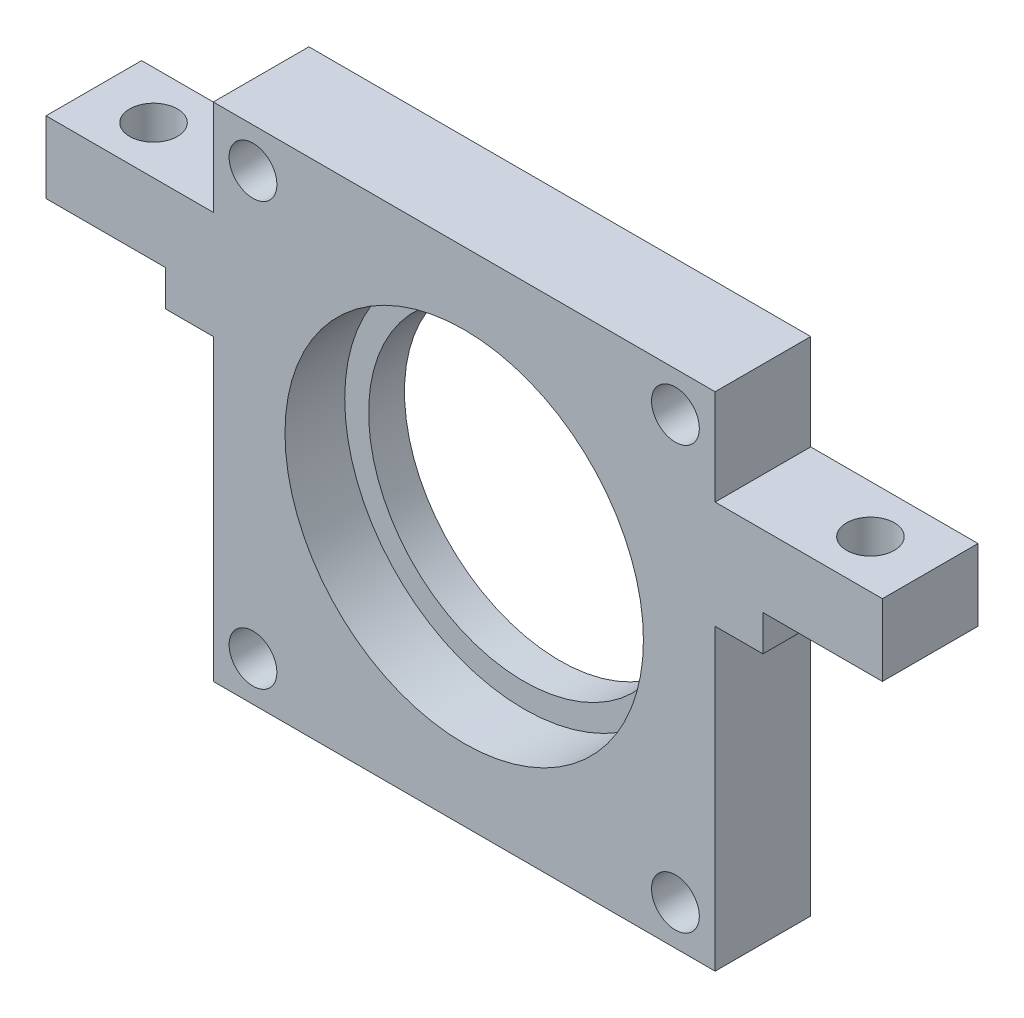
ISO-10303-21;
HEADER;
FILE_DESCRIPTION(('STEP AP214'),'2;1');
FILE_NAME('part.step','',(''),(''),'','','');
FILE_SCHEMA(('AUTOMOTIVE_DESIGN { 1 0 10303 214 1 1 1 1 }'));
ENDSEC;
DATA;
#1=APPLICATION_CONTEXT('core data for automotive mechanical design processes');
#2=APPLICATION_PROTOCOL_DEFINITION('international standard','automotive_design',2000,#1);
#3=PRODUCT_CONTEXT('',#1,'mechanical');
#4=PRODUCT('Part','Part','',(#3));
#5=PRODUCT_RELATED_PRODUCT_CATEGORY('part','',(#4));
#6=PRODUCT_DEFINITION_FORMATION('','',#4);
#7=PRODUCT_DEFINITION_CONTEXT('part definition',#1,'design');
#8=PRODUCT_DEFINITION('design','',#6,#7);
#9=PRODUCT_DEFINITION_SHAPE('','',#8);
#10=(LENGTH_UNIT() NAMED_UNIT(*) SI_UNIT(.MILLI.,.METRE.));
#11=(NAMED_UNIT(*) PLANE_ANGLE_UNIT() SI_UNIT($,.RADIAN.));
#12=(NAMED_UNIT(*) SI_UNIT($,.STERADIAN.) SOLID_ANGLE_UNIT());
#13=UNCERTAINTY_MEASURE_WITH_UNIT(LENGTH_MEASURE(1.E-05),#10,'distance_accuracy_value','');
#14=(GEOMETRIC_REPRESENTATION_CONTEXT(3) GLOBAL_UNCERTAINTY_ASSIGNED_CONTEXT((#13)) GLOBAL_UNIT_ASSIGNED_CONTEXT((#10,
#11,#12)) REPRESENTATION_CONTEXT('',''));
#15=CARTESIAN_POINT('',(0.,0.,0.));
#16=DIRECTION('',(0.,0.,1.));
#17=DIRECTION('',(1.,0.,0.));
#18=AXIS2_PLACEMENT_3D('',#15,#16,#17);
#19=CARTESIAN_POINT('',(-21.,21.,4.));
#20=DIRECTION('',(1.,0.,0.));
#21=DIRECTION('',(0.,0.,-1.));
#22=AXIS2_PLACEMENT_3D('',#19,#20,#21);
#23=PLANE('',#22);
#24=DIRECTION('',(0.,-1.,0.));
#25=VECTOR('',#24,1.);
#26=CARTESIAN_POINT('',(-21.,21.,-4.));
#27=LINE('',#26,#25);
#28=CARTESIAN_POINT('',(-21.,21.,-4.));
#29=VERTEX_POINT('',#28);
#30=CARTESIAN_POINT('',(-21.,13.,-4.));
#31=VERTEX_POINT('',#30);
#32=EDGE_CURVE('E182',#29,#31,#27,.T.);
#33=ORIENTED_EDGE('',*,*,#32,.T.);
#34=DIRECTION('',(0.,0.,-1.));
#35=VECTOR('',#34,1.);
#36=CARTESIAN_POINT('',(-21.,13.,4.));
#37=LINE('',#36,#35);
#38=CARTESIAN_POINT('',(-21.,13.,4.));
#39=VERTEX_POINT('',#38);
#40=EDGE_CURVE('E11',#39,#31,#37,.T.);
#41=ORIENTED_EDGE('',*,*,#40,.F.);
#42=DIRECTION('',(0.,-1.,0.));
#43=VECTOR('',#42,1.);
#44=CARTESIAN_POINT('',(-21.,21.,4.));
#45=LINE('',#44,#43);
#46=CARTESIAN_POINT('',(-21.,21.,4.));
#47=VERTEX_POINT('',#46);
#48=EDGE_CURVE('E213',#47,#39,#45,.T.);
#49=ORIENTED_EDGE('',*,*,#48,.F.);
#50=DIRECTION('',(0.,0.,-1.));
#51=VECTOR('',#50,1.);
#52=CARTESIAN_POINT('',(-21.,21.,4.));
#53=LINE('',#52,#51);
#54=EDGE_CURVE('E178',#47,#29,#53,.T.);
#55=ORIENTED_EDGE('',*,*,#54,.T.);
#56=EDGE_LOOP('',(#33,#41,#49,#55));
#57=FACE_BOUND('',#56,.T.);
#58=ADVANCED_FACE('F37',(#57),#23,.F.);
#59=CARTESIAN_POINT('',(-35.,13.,4.));
#60=DIRECTION('',(0.,-1.,0.));
#61=DIRECTION('',(0.,0.,-1.));
#62=AXIS2_PLACEMENT_3D('',#59,#60,#61);
#63=PLANE('',#62);
#64=CARTESIAN_POINT('',(-30.,13.,0.));
#65=DIRECTION('',(0.,1.,0.));
#66=DIRECTION('',(-1.,0.,0.));
#67=AXIS2_PLACEMENT_3D('',#64,#65,#66);
#68=CIRCLE('',#67,2.);
#69=CARTESIAN_POINT('',(-32.,13.,0.));
#70=VERTEX_POINT('',#69);
#71=EDGE_CURVE('E366',#70,#70,#68,.T.);
#72=ORIENTED_EDGE('',*,*,#71,.F.);
#73=EDGE_LOOP('',(#72));
#74=FACE_BOUND('',#73,.T.);
#75=DIRECTION('',(-1.,0.,0.));
#76=VECTOR('',#75,1.);
#77=CARTESIAN_POINT('',(-35.,13.,-4.));
#78=LINE('',#77,#76);
#79=CARTESIAN_POINT('',(-35.,13.,-4.));
#80=VERTEX_POINT('',#79);
#81=EDGE_CURVE('E185',#31,#80,#78,.T.);
#82=ORIENTED_EDGE('',*,*,#81,.T.);
#83=DIRECTION('',(0.,0.,-1.));
#84=VECTOR('',#83,1.);
#85=CARTESIAN_POINT('',(-35.,13.,4.));
#86=LINE('',#85,#84);
#87=CARTESIAN_POINT('',(-35.,13.,4.));
#88=VERTEX_POINT('',#87);
#89=EDGE_CURVE('E46',#88,#80,#86,.T.);
#90=ORIENTED_EDGE('',*,*,#89,.F.);
#91=DIRECTION('',(-1.,0.,0.));
#92=VECTOR('',#91,1.);
#93=CARTESIAN_POINT('',(-35.,13.,4.));
#94=LINE('',#93,#92);
#95=EDGE_CURVE('E121',#39,#88,#94,.T.);
#96=ORIENTED_EDGE('',*,*,#95,.F.);
#97=ORIENTED_EDGE('',*,*,#40,.T.);
#98=EDGE_LOOP('',(#82,#90,#96,#97));
#99=FACE_BOUND('',#98,.T.);
#100=ADVANCED_FACE('F313',(#74,#99),#63,.F.);
#101=CARTESIAN_POINT('',(-35.,7.,4.));
#102=DIRECTION('',(1.,0.,0.));
#103=DIRECTION('',(0.,0.,-1.));
#104=AXIS2_PLACEMENT_3D('',#101,#102,#103);
#105=PLANE('',#104);
#106=DIRECTION('',(0.,-1.,0.));
#107=VECTOR('',#106,1.);
#108=CARTESIAN_POINT('',(-35.,7.,-4.));
#109=LINE('',#108,#107);
#110=CARTESIAN_POINT('',(-35.,7.,-4.));
#111=VERTEX_POINT('',#110);
#112=EDGE_CURVE('E188',#80,#111,#109,.T.);
#113=ORIENTED_EDGE('',*,*,#112,.T.);
#114=DIRECTION('',(0.,0.,-1.));
#115=VECTOR('',#114,1.);
#116=CARTESIAN_POINT('',(-35.,7.,4.));
#117=LINE('',#116,#115);
#118=CARTESIAN_POINT('',(-35.,7.,4.));
#119=VERTEX_POINT('',#118);
#120=EDGE_CURVE('E244',#119,#111,#117,.T.);
#121=ORIENTED_EDGE('',*,*,#120,.F.);
#122=DIRECTION('',(0.,-1.,0.));
#123=VECTOR('',#122,1.);
#124=CARTESIAN_POINT('',(-35.,7.,4.));
#125=LINE('',#124,#123);
#126=EDGE_CURVE('E253',#88,#119,#125,.T.);
#127=ORIENTED_EDGE('',*,*,#126,.F.);
#128=ORIENTED_EDGE('',*,*,#89,.T.);
#129=EDGE_LOOP('',(#113,#121,#127,#128));
#130=FACE_BOUND('',#129,.T.);
#131=ADVANCED_FACE('F251',(#130),#105,.F.);
#132=CARTESIAN_POINT('',(-25.,7.,4.));
#133=DIRECTION('',(0.,1.,0.));
#134=DIRECTION('',(-1.,0.,0.));
#135=AXIS2_PLACEMENT_3D('',#132,#133,#134);
#136=PLANE('',#135);
#137=CARTESIAN_POINT('',(-30.,7.,0.));
#138=DIRECTION('',(0.,1.,0.));
#139=DIRECTION('',(-1.,0.,0.));
#140=AXIS2_PLACEMENT_3D('',#137,#138,#139);
#141=CIRCLE('',#140,2.);
#142=CARTESIAN_POINT('',(-32.,7.,0.));
#143=VERTEX_POINT('',#142);
#144=EDGE_CURVE('E40',#143,#143,#141,.T.);
#145=ORIENTED_EDGE('',*,*,#144,.T.);
#146=EDGE_LOOP('',(#145));
#147=FACE_BOUND('',#146,.T.);
#148=DIRECTION('',(1.,0.,0.));
#149=VECTOR('',#148,1.);
#150=CARTESIAN_POINT('',(-25.,7.,-4.));
#151=LINE('',#150,#149);
#152=CARTESIAN_POINT('',(-25.,7.,-4.));
#153=VERTEX_POINT('',#152);
#154=EDGE_CURVE('E190',#111,#153,#151,.T.);
#155=ORIENTED_EDGE('',*,*,#154,.T.);
#156=DIRECTION('',(0.,0.,-1.));
#157=VECTOR('',#156,1.);
#158=CARTESIAN_POINT('',(-25.,7.,4.));
#159=LINE('',#158,#157);
#160=CARTESIAN_POINT('',(-25.,7.,4.));
#161=VERTEX_POINT('',#160);
#162=EDGE_CURVE('E241',#161,#153,#159,.T.);
#163=ORIENTED_EDGE('',*,*,#162,.F.);
#164=DIRECTION('',(1.,0.,0.));
#165=VECTOR('',#164,1.);
#166=CARTESIAN_POINT('',(-25.,7.,4.));
#167=LINE('',#166,#165);
#168=EDGE_CURVE('E271',#119,#161,#167,.T.);
#169=ORIENTED_EDGE('',*,*,#168,.F.);
#170=ORIENTED_EDGE('',*,*,#120,.T.);
#171=EDGE_LOOP('',(#155,#163,#169,#170));
#172=FACE_BOUND('',#171,.T.);
#173=ADVANCED_FACE('F262',(#147,#172),#136,.F.);
#174=CARTESIAN_POINT('',(-25.,7.,4.));
#175=DIRECTION('',(1.,0.,0.));
#176=DIRECTION('',(0.,0.,-1.));
#177=AXIS2_PLACEMENT_3D('',#174,#175,#176);
#178=PLANE('',#177);
#179=DIRECTION('',(0.,-1.,0.));
#180=VECTOR('',#179,1.);
#181=CARTESIAN_POINT('',(-25.,7.,-4.));
#182=LINE('',#181,#180);
#183=CARTESIAN_POINT('',(-25.,4.,-4.));
#184=VERTEX_POINT('',#183);
#185=EDGE_CURVE('E192',#153,#184,#182,.T.);
#186=ORIENTED_EDGE('',*,*,#185,.T.);
#187=DIRECTION('',(0.,0.,-1.));
#188=VECTOR('',#187,1.);
#189=CARTESIAN_POINT('',(-25.,4.,4.));
#190=LINE('',#189,#188);
#191=CARTESIAN_POINT('',(-25.,4.,4.));
#192=VERTEX_POINT('',#191);
#193=EDGE_CURVE('E238',#192,#184,#190,.T.);
#194=ORIENTED_EDGE('',*,*,#193,.F.);
#195=DIRECTION('',(0.,-1.,0.));
#196=VECTOR('',#195,1.);
#197=CARTESIAN_POINT('',(-25.,7.,4.));
#198=LINE('',#197,#196);
#199=EDGE_CURVE('E268',#161,#192,#198,.T.);
#200=ORIENTED_EDGE('',*,*,#199,.F.);
#201=ORIENTED_EDGE('',*,*,#162,.T.);
#202=EDGE_LOOP('',(#186,#194,#200,#201));
#203=FACE_BOUND('',#202,.T.);
#204=ADVANCED_FACE('F266',(#203),#178,.F.);
#205=CARTESIAN_POINT('',(-25.,4.,4.));
#206=DIRECTION('',(0.,1.,0.));
#207=DIRECTION('',(0.,0.,1.));
#208=AXIS2_PLACEMENT_3D('',#205,#206,#207);
#209=PLANE('',#208);
#210=DIRECTION('',(1.,0.,0.));
#211=VECTOR('',#210,1.);
#212=CARTESIAN_POINT('',(-25.,4.,-4.));
#213=LINE('',#212,#211);
#214=CARTESIAN_POINT('',(-21.,4.,-4.));
#215=VERTEX_POINT('',#214);
#216=EDGE_CURVE('E194',#184,#215,#213,.T.);
#217=ORIENTED_EDGE('',*,*,#216,.T.);
#218=DIRECTION('',(0.,0.,-1.));
#219=VECTOR('',#218,1.);
#220=CARTESIAN_POINT('',(-21.,4.,4.));
#221=LINE('',#220,#219);
#222=CARTESIAN_POINT('',(-21.,4.,4.));
#223=VERTEX_POINT('',#222);
#224=EDGE_CURVE('E235',#223,#215,#221,.T.);
#225=ORIENTED_EDGE('',*,*,#224,.F.);
#226=DIRECTION('',(1.,0.,0.));
#227=VECTOR('',#226,1.);
#228=CARTESIAN_POINT('',(-25.,4.,4.));
#229=LINE('',#228,#227);
#230=EDGE_CURVE('E270',#192,#223,#229,.T.);
#231=ORIENTED_EDGE('',*,*,#230,.F.);
#232=ORIENTED_EDGE('',*,*,#193,.T.);
#233=EDGE_LOOP('',(#217,#225,#231,#232));
#234=FACE_BOUND('',#233,.T.);
#235=ADVANCED_FACE('F329',(#234),#209,.F.);
#236=CARTESIAN_POINT('',(-21.,4.,4.));
#237=DIRECTION('',(1.,0.,0.));
#238=DIRECTION('',(0.,0.,-1.));
#239=AXIS2_PLACEMENT_3D('',#236,#237,#238);
#240=PLANE('',#239);
#241=DIRECTION('',(0.,-1.,0.));
#242=VECTOR('',#241,1.);
#243=CARTESIAN_POINT('',(-21.,4.,-4.));
#244=LINE('',#243,#242);
#245=CARTESIAN_POINT('',(-21.,-21.,-4.));
#246=VERTEX_POINT('',#245);
#247=EDGE_CURVE('E196',#215,#246,#244,.T.);
#248=ORIENTED_EDGE('',*,*,#247,.T.);
#249=DIRECTION('',(0.,0.,-1.));
#250=VECTOR('',#249,1.);
#251=CARTESIAN_POINT('',(-21.,-21.,4.));
#252=LINE('',#251,#250);
#253=CARTESIAN_POINT('',(-21.,-21.,4.));
#254=VERTEX_POINT('',#253);
#255=EDGE_CURVE('E232',#254,#246,#252,.T.);
#256=ORIENTED_EDGE('',*,*,#255,.F.);
#257=DIRECTION('',(0.,-1.,0.));
#258=VECTOR('',#257,1.);
#259=CARTESIAN_POINT('',(-21.,4.,4.));
#260=LINE('',#259,#258);
#261=EDGE_CURVE('E273',#223,#254,#260,.T.);
#262=ORIENTED_EDGE('',*,*,#261,.F.);
#263=ORIENTED_EDGE('',*,*,#224,.T.);
#264=EDGE_LOOP('',(#248,#256,#262,#263));
#265=FACE_BOUND('',#264,.T.);
#266=ADVANCED_FACE('F332',(#265),#240,.F.);
#267=CARTESIAN_POINT('',(-21.,-21.,4.));
#268=DIRECTION('',(0.,1.,0.));
#269=DIRECTION('',(-1.,0.,0.));
#270=AXIS2_PLACEMENT_3D('',#267,#268,#269);
#271=PLANE('',#270);
#272=DIRECTION('',(1.,0.,0.));
#273=VECTOR('',#272,1.);
#274=CARTESIAN_POINT('',(-21.,-21.,-4.));
#275=LINE('',#274,#273);
#276=CARTESIAN_POINT('',(21.,-21.,-4.));
#277=VERTEX_POINT('',#276);
#278=EDGE_CURVE('E198',#246,#277,#275,.T.);
#279=ORIENTED_EDGE('',*,*,#278,.T.);
#280=DIRECTION('',(0.,0.,-1.));
#281=VECTOR('',#280,1.);
#282=CARTESIAN_POINT('',(21.,-21.,4.));
#283=LINE('',#282,#281);
#284=CARTESIAN_POINT('',(21.,-21.,4.));
#285=VERTEX_POINT('',#284);
#286=EDGE_CURVE('E229',#285,#277,#283,.T.);
#287=ORIENTED_EDGE('',*,*,#286,.F.);
#288=DIRECTION('',(1.,0.,0.));
#289=VECTOR('',#288,1.);
#290=CARTESIAN_POINT('',(-21.,-21.,4.));
#291=LINE('',#290,#289);
#292=EDGE_CURVE('E279',#254,#285,#291,.T.);
#293=ORIENTED_EDGE('',*,*,#292,.F.);
#294=ORIENTED_EDGE('',*,*,#255,.T.);
#295=EDGE_LOOP('',(#279,#287,#293,#294));
#296=FACE_BOUND('',#295,.T.);
#297=ADVANCED_FACE('F336',(#296),#271,.F.);
#298=CARTESIAN_POINT('',(21.,4.00000000000001,4.));
#299=DIRECTION('',(-1.,0.,0.));
#300=DIRECTION('',(0.,-1.,0.));
#301=AXIS2_PLACEMENT_3D('',#298,#299,#300);
#302=PLANE('',#301);
#303=DIRECTION('',(0.,1.,0.));
#304=VECTOR('',#303,1.);
#305=CARTESIAN_POINT('',(21.,4.00000000000001,-4.));
#306=LINE('',#305,#304);
#307=CARTESIAN_POINT('',(21.,4.00000000000001,-4.));
#308=VERTEX_POINT('',#307);
#309=EDGE_CURVE('E200',#277,#308,#306,.T.);
#310=ORIENTED_EDGE('',*,*,#309,.T.);
#311=DIRECTION('',(0.,0.,-1.));
#312=VECTOR('',#311,1.);
#313=CARTESIAN_POINT('',(21.,4.00000000000001,4.));
#314=LINE('',#313,#312);
#315=CARTESIAN_POINT('',(21.,4.00000000000001,4.));
#316=VERTEX_POINT('',#315);
#317=EDGE_CURVE('E226',#316,#308,#314,.T.);
#318=ORIENTED_EDGE('',*,*,#317,.F.);
#319=DIRECTION('',(0.,1.,0.));
#320=VECTOR('',#319,1.);
#321=CARTESIAN_POINT('',(21.,4.00000000000001,4.));
#322=LINE('',#321,#320);
#323=EDGE_CURVE('E281',#285,#316,#322,.T.);
#324=ORIENTED_EDGE('',*,*,#323,.F.);
#325=ORIENTED_EDGE('',*,*,#286,.T.);
#326=EDGE_LOOP('',(#310,#318,#324,#325));
#327=FACE_BOUND('',#326,.T.);
#328=ADVANCED_FACE('F340',(#327),#302,.F.);
#329=CARTESIAN_POINT('',(25.,4.00000000000001,4.));
#330=DIRECTION('',(0.,1.,0.));
#331=DIRECTION('',(-1.,0.,0.));
#332=AXIS2_PLACEMENT_3D('',#329,#330,#331);
#333=PLANE('',#332);
#334=DIRECTION('',(1.,0.,0.));
#335=VECTOR('',#334,1.);
#336=CARTESIAN_POINT('',(25.,4.00000000000001,-4.));
#337=LINE('',#336,#335);
#338=CARTESIAN_POINT('',(25.,4.00000000000001,-4.));
#339=VERTEX_POINT('',#338);
#340=EDGE_CURVE('E202',#308,#339,#337,.T.);
#341=ORIENTED_EDGE('',*,*,#340,.T.);
#342=DIRECTION('',(0.,0.,-1.));
#343=VECTOR('',#342,1.);
#344=CARTESIAN_POINT('',(25.,4.00000000000001,4.));
#345=LINE('',#344,#343);
#346=CARTESIAN_POINT('',(25.,4.00000000000001,4.));
#347=VERTEX_POINT('',#346);
#348=EDGE_CURVE('E223',#347,#339,#345,.T.);
#349=ORIENTED_EDGE('',*,*,#348,.F.);
#350=DIRECTION('',(1.,0.,0.));
#351=VECTOR('',#350,1.);
#352=CARTESIAN_POINT('',(25.,4.00000000000001,4.));
#353=LINE('',#352,#351);
#354=EDGE_CURVE('E283',#316,#347,#353,.T.);
#355=ORIENTED_EDGE('',*,*,#354,.F.);
#356=ORIENTED_EDGE('',*,*,#317,.T.);
#357=EDGE_LOOP('',(#341,#349,#355,#356));
#358=FACE_BOUND('',#357,.T.);
#359=ADVANCED_FACE('F344',(#358),#333,.F.);
#360=CARTESIAN_POINT('',(25.,7.00000000000001,4.));
#361=DIRECTION('',(-1.,0.,0.));
#362=DIRECTION('',(0.,0.,1.));
#363=AXIS2_PLACEMENT_3D('',#360,#361,#362);
#364=PLANE('',#363);
#365=DIRECTION('',(0.,1.,0.));
#366=VECTOR('',#365,1.);
#367=CARTESIAN_POINT('',(25.,7.00000000000001,-4.));
#368=LINE('',#367,#366);
#369=CARTESIAN_POINT('',(25.,7.00000000000001,-4.));
#370=VERTEX_POINT('',#369);
#371=EDGE_CURVE('E204',#339,#370,#368,.T.);
#372=ORIENTED_EDGE('',*,*,#371,.T.);
#373=DIRECTION('',(0.,0.,-1.));
#374=VECTOR('',#373,1.);
#375=CARTESIAN_POINT('',(25.,7.00000000000001,4.));
#376=LINE('',#375,#374);
#377=CARTESIAN_POINT('',(25.,7.00000000000001,4.));
#378=VERTEX_POINT('',#377);
#379=EDGE_CURVE('E220',#378,#370,#376,.T.);
#380=ORIENTED_EDGE('',*,*,#379,.F.);
#381=DIRECTION('',(0.,1.,0.));
#382=VECTOR('',#381,1.);
#383=CARTESIAN_POINT('',(25.,7.00000000000001,4.));
#384=LINE('',#383,#382);
#385=EDGE_CURVE('E285',#347,#378,#384,.T.);
#386=ORIENTED_EDGE('',*,*,#385,.F.);
#387=ORIENTED_EDGE('',*,*,#348,.T.);
#388=EDGE_LOOP('',(#372,#380,#386,#387));
#389=FACE_BOUND('',#388,.T.);
#390=ADVANCED_FACE('F348',(#389),#364,.F.);
#391=CARTESIAN_POINT('',(25.,7.00000000000001,4.));
#392=DIRECTION('',(0.,1.,0.));
#393=DIRECTION('',(-1.,0.,0.));
#394=AXIS2_PLACEMENT_3D('',#391,#392,#393);
#395=PLANE('',#394);
#396=CARTESIAN_POINT('',(30.,7.00000000000001,0.));
#397=DIRECTION('',(0.,1.,0.));
#398=DIRECTION('',(-1.,0.,0.));
#399=AXIS2_PLACEMENT_3D('',#396,#397,#398);
#400=CIRCLE('',#399,2.00000000000001);
#401=CARTESIAN_POINT('',(28.,7.00000000000001,0.));
#402=VERTEX_POINT('',#401);
#403=EDGE_CURVE('E370',#402,#402,#400,.T.);
#404=ORIENTED_EDGE('',*,*,#403,.T.);
#405=EDGE_LOOP('',(#404));
#406=FACE_BOUND('',#405,.T.);
#407=DIRECTION('',(1.,0.,0.));
#408=VECTOR('',#407,1.);
#409=CARTESIAN_POINT('',(25.,7.00000000000001,-4.));
#410=LINE('',#409,#408);
#411=CARTESIAN_POINT('',(35.,7.00000000000001,-4.));
#412=VERTEX_POINT('',#411);
#413=EDGE_CURVE('E206',#370,#412,#410,.T.);
#414=ORIENTED_EDGE('',*,*,#413,.T.);
#415=DIRECTION('',(0.,0.,-1.));
#416=VECTOR('',#415,1.);
#417=CARTESIAN_POINT('',(35.,7.00000000000001,4.));
#418=LINE('',#417,#416);
#419=CARTESIAN_POINT('',(35.,7.00000000000001,4.));
#420=VERTEX_POINT('',#419);
#421=EDGE_CURVE('E217',#420,#412,#418,.T.);
#422=ORIENTED_EDGE('',*,*,#421,.F.);
#423=DIRECTION('',(1.,0.,0.));
#424=VECTOR('',#423,1.);
#425=CARTESIAN_POINT('',(25.,7.00000000000001,4.));
#426=LINE('',#425,#424);
#427=EDGE_CURVE('E287',#378,#420,#426,.T.);
#428=ORIENTED_EDGE('',*,*,#427,.F.);
#429=ORIENTED_EDGE('',*,*,#379,.T.);
#430=EDGE_LOOP('',(#414,#422,#428,#429));
#431=FACE_BOUND('',#430,.T.);
#432=ADVANCED_FACE('F293',(#406,#431),#395,.F.);
#433=CARTESIAN_POINT('',(35.,7.00000000000001,4.));
#434=DIRECTION('',(-1.,0.,0.));
#435=DIRECTION('',(0.,0.,1.));
#436=AXIS2_PLACEMENT_3D('',#433,#434,#435);
#437=PLANE('',#436);
#438=DIRECTION('',(0.,1.,0.));
#439=VECTOR('',#438,1.);
#440=CARTESIAN_POINT('',(35.,7.00000000000001,-4.));
#441=LINE('',#440,#439);
#442=CARTESIAN_POINT('',(35.,13.,-4.));
#443=VERTEX_POINT('',#442);
#444=EDGE_CURVE('E208',#412,#443,#441,.T.);
#445=ORIENTED_EDGE('',*,*,#444,.T.);
#446=DIRECTION('',(0.,0.,-1.));
#447=VECTOR('',#446,1.);
#448=CARTESIAN_POINT('',(35.,13.,4.));
#449=LINE('',#448,#447);
#450=CARTESIAN_POINT('',(35.,13.,4.));
#451=VERTEX_POINT('',#450);
#452=EDGE_CURVE('E173',#451,#443,#449,.T.);
#453=ORIENTED_EDGE('',*,*,#452,.F.);
#454=DIRECTION('',(0.,1.,0.));
#455=VECTOR('',#454,1.);
#456=CARTESIAN_POINT('',(35.,7.00000000000001,4.));
#457=LINE('',#456,#455);
#458=EDGE_CURVE('E164',#420,#451,#457,.T.);
#459=ORIENTED_EDGE('',*,*,#458,.F.);
#460=ORIENTED_EDGE('',*,*,#421,.T.);
#461=EDGE_LOOP('',(#445,#453,#459,#460));
#462=FACE_BOUND('',#461,.T.);
#463=ADVANCED_FACE('F297',(#462),#437,.F.);
#464=CARTESIAN_POINT('',(35.,13.,4.));
#465=DIRECTION('',(0.,-1.,0.));
#466=DIRECTION('',(1.,0.,0.));
#467=AXIS2_PLACEMENT_3D('',#464,#465,#466);
#468=PLANE('',#467);
#469=CARTESIAN_POINT('',(30.,13.,0.));
#470=DIRECTION('',(0.,1.,0.));
#471=DIRECTION('',(1.,0.,0.));
#472=AXIS2_PLACEMENT_3D('',#469,#470,#471);
#473=CIRCLE('',#472,2.00000000000001);
#474=CARTESIAN_POINT('',(32.,13.,0.));
#475=VERTEX_POINT('',#474);
#476=EDGE_CURVE('E364',#475,#475,#473,.T.);
#477=ORIENTED_EDGE('',*,*,#476,.F.);
#478=EDGE_LOOP('',(#477));
#479=FACE_BOUND('',#478,.T.);
#480=DIRECTION('',(-1.,0.,0.));
#481=VECTOR('',#480,1.);
#482=CARTESIAN_POINT('',(35.,13.,-4.));
#483=LINE('',#482,#481);
#484=CARTESIAN_POINT('',(21.,13.,-4.));
#485=VERTEX_POINT('',#484);
#486=EDGE_CURVE('E172',#443,#485,#483,.T.);
#487=ORIENTED_EDGE('',*,*,#486,.T.);
#488=DIRECTION('',(0.,0.,-1.));
#489=VECTOR('',#488,1.);
#490=CARTESIAN_POINT('',(21.,13.,4.));
#491=LINE('',#490,#489);
#492=CARTESIAN_POINT('',(21.,13.,4.));
#493=VERTEX_POINT('',#492);
#494=EDGE_CURVE('E169',#493,#485,#491,.T.);
#495=ORIENTED_EDGE('',*,*,#494,.F.);
#496=DIRECTION('',(-1.,0.,0.));
#497=VECTOR('',#496,1.);
#498=CARTESIAN_POINT('',(35.,13.,4.));
#499=LINE('',#498,#497);
#500=EDGE_CURVE('E158',#451,#493,#499,.T.);
#501=ORIENTED_EDGE('',*,*,#500,.F.);
#502=ORIENTED_EDGE('',*,*,#452,.T.);
#503=EDGE_LOOP('',(#487,#495,#501,#502));
#504=FACE_BOUND('',#503,.T.);
#505=ADVANCED_FACE('F170',(#479,#504),#468,.F.);
#506=CARTESIAN_POINT('',(21.,21.,4.));
#507=DIRECTION('',(-1.,0.,0.));
#508=DIRECTION('',(0.,-1.,0.));
#509=AXIS2_PLACEMENT_3D('',#506,#507,#508);
#510=PLANE('',#509);
#511=DIRECTION('',(0.,1.,0.));
#512=VECTOR('',#511,1.);
#513=CARTESIAN_POINT('',(21.,21.,-4.));
#514=LINE('',#513,#512);
#515=CARTESIAN_POINT('',(21.,21.,-4.));
#516=VERTEX_POINT('',#515);
#517=EDGE_CURVE('E107',#485,#516,#514,.T.);
#518=ORIENTED_EDGE('',*,*,#517,.T.);
#519=DIRECTION('',(0.,0.,-1.));
#520=VECTOR('',#519,1.);
#521=CARTESIAN_POINT('',(21.,21.,4.));
#522=LINE('',#521,#520);
#523=CARTESIAN_POINT('',(21.,21.,4.));
#524=VERTEX_POINT('',#523);
#525=EDGE_CURVE('E174',#524,#516,#522,.T.);
#526=ORIENTED_EDGE('',*,*,#525,.F.);
#527=DIRECTION('',(0.,1.,0.));
#528=VECTOR('',#527,1.);
#529=CARTESIAN_POINT('',(21.,21.,4.));
#530=LINE('',#529,#528);
#531=EDGE_CURVE('E162',#493,#524,#530,.T.);
#532=ORIENTED_EDGE('',*,*,#531,.F.);
#533=ORIENTED_EDGE('',*,*,#494,.T.);
#534=EDGE_LOOP('',(#518,#526,#532,#533));
#535=FACE_BOUND('',#534,.T.);
#536=ADVANCED_FACE('F176',(#535),#510,.F.);
#537=CARTESIAN_POINT('',(-21.,21.,4.));
#538=DIRECTION('',(0.,-1.,0.));
#539=DIRECTION('',(1.,0.,0.));
#540=AXIS2_PLACEMENT_3D('',#537,#538,#539);
#541=PLANE('',#540);
#542=DIRECTION('',(-1.,0.,0.));
#543=VECTOR('',#542,1.);
#544=CARTESIAN_POINT('',(-21.,21.,-4.));
#545=LINE('',#544,#543);
#546=EDGE_CURVE('E113',#516,#29,#545,.T.);
#547=ORIENTED_EDGE('',*,*,#546,.T.);
#548=ORIENTED_EDGE('',*,*,#54,.F.);
#549=DIRECTION('',(-1.,0.,0.));
#550=VECTOR('',#549,1.);
#551=CARTESIAN_POINT('',(-21.,21.,4.));
#552=LINE('',#551,#550);
#553=EDGE_CURVE('E54',#524,#47,#552,.T.);
#554=ORIENTED_EDGE('',*,*,#553,.F.);
#555=ORIENTED_EDGE('',*,*,#525,.T.);
#556=EDGE_LOOP('',(#547,#548,#554,#555));
#557=FACE_BOUND('',#556,.T.);
#558=ADVANCED_FACE('F301',(#557),#541,.F.);
#559=CARTESIAN_POINT('',(0.,0.,4.));
#560=DIRECTION('',(0.,0.,1.));
#561=DIRECTION('',(1.,0.,0.));
#562=AXIS2_PLACEMENT_3D('',#559,#560,#561);
#563=PLANE('',#562);
#564=CARTESIAN_POINT('',(-17.6776695296637,-17.6776695296637,4.));
#565=DIRECTION('',(0.,0.,1.));
#566=DIRECTION('',(1.,0.,0.));
#567=AXIS2_PLACEMENT_3D('',#564,#565,#566);
#568=CIRCLE('',#567,2.00000000000023);
#569=CARTESIAN_POINT('',(-15.6776695296635,-17.6776695296637,4.));
#570=VERTEX_POINT('',#569);
#571=EDGE_CURVE('E395',#570,#570,#568,.T.);
#572=ORIENTED_EDGE('',*,*,#571,.F.);
#573=EDGE_LOOP('',(#572));
#574=FACE_BOUND('',#573,.T.);
#575=CARTESIAN_POINT('',(17.6776695296637,-17.6776695296637,4.));
#576=DIRECTION('',(0.,0.,1.));
#577=DIRECTION('',(1.,0.,0.));
#578=AXIS2_PLACEMENT_3D('',#575,#576,#577);
#579=CIRCLE('',#578,2.00000000000016);
#580=CARTESIAN_POINT('',(19.6776695296639,-17.6776695296637,4.));
#581=VERTEX_POINT('',#580);
#582=EDGE_CURVE('E389',#581,#581,#579,.T.);
#583=ORIENTED_EDGE('',*,*,#582,.F.);
#584=EDGE_LOOP('',(#583));
#585=FACE_BOUND('',#584,.T.);
#586=CARTESIAN_POINT('',(17.6776695296637,17.6776695296637,4.));
#587=DIRECTION('',(0.,0.,1.));
#588=DIRECTION('',(1.,0.,0.));
#589=AXIS2_PLACEMENT_3D('',#586,#587,#588);
#590=CIRCLE('',#589,2.00000000000008);
#591=CARTESIAN_POINT('',(19.6776695296638,17.6776695296637,4.));
#592=VERTEX_POINT('',#591);
#593=EDGE_CURVE('E383',#592,#592,#590,.T.);
#594=ORIENTED_EDGE('',*,*,#593,.F.);
#595=EDGE_LOOP('',(#594));
#596=FACE_BOUND('',#595,.T.);
#597=CARTESIAN_POINT('',(-17.6776695296637,17.6776695296637,4.));
#598=DIRECTION('',(0.,0.,1.));
#599=DIRECTION('',(1.,0.,0.));
#600=AXIS2_PLACEMENT_3D('',#597,#598,#599);
#601=CIRCLE('',#600,2.);
#602=CARTESIAN_POINT('',(-15.6776695296637,17.6776695296637,4.));
#603=VERTEX_POINT('',#602);
#604=EDGE_CURVE('E382',#603,#603,#601,.T.);
#605=ORIENTED_EDGE('',*,*,#604,.F.);
#606=EDGE_LOOP('',(#605));
#607=FACE_BOUND('',#606,.T.);
#608=CARTESIAN_POINT('',(0.,0.,4.));
#609=DIRECTION('',(0.,0.,1.));
#610=DIRECTION('',(1.,0.,0.));
#611=AXIS2_PLACEMENT_3D('',#608,#609,#610);
#612=CIRCLE('',#611,15.);
#613=CARTESIAN_POINT('',(15.,0.,4.));
#614=VERTEX_POINT('',#613);
#615=EDGE_CURVE('E401',#614,#614,#612,.T.);
#616=ORIENTED_EDGE('',*,*,#615,.F.);
#617=EDGE_LOOP('',(#616));
#618=FACE_BOUND('',#617,.T.);
#619=ORIENTED_EDGE('',*,*,#48,.T.);
#620=ORIENTED_EDGE('',*,*,#95,.T.);
#621=ORIENTED_EDGE('',*,*,#126,.T.);
#622=ORIENTED_EDGE('',*,*,#168,.T.);
#623=ORIENTED_EDGE('',*,*,#199,.T.);
#624=ORIENTED_EDGE('',*,*,#230,.T.);
#625=ORIENTED_EDGE('',*,*,#261,.T.);
#626=ORIENTED_EDGE('',*,*,#292,.T.);
#627=ORIENTED_EDGE('',*,*,#323,.T.);
#628=ORIENTED_EDGE('',*,*,#354,.T.);
#629=ORIENTED_EDGE('',*,*,#385,.T.);
#630=ORIENTED_EDGE('',*,*,#427,.T.);
#631=ORIENTED_EDGE('',*,*,#458,.T.);
#632=ORIENTED_EDGE('',*,*,#500,.T.);
#633=ORIENTED_EDGE('',*,*,#531,.T.);
#634=ORIENTED_EDGE('',*,*,#553,.T.);
#635=EDGE_LOOP('',(#619,#620,#621,#622,#623,#624,#625,#626,#627,#628,#629,#630,#631,#632,#633,#634));
#636=FACE_BOUND('',#635,.T.);
#637=ADVANCED_FACE('F160',(#574,#585,#596,#607,#618,#636),#563,.T.);
#638=CARTESIAN_POINT('',(0.,0.,-4.));
#639=DIRECTION('',(0.,0.,1.));
#640=DIRECTION('',(1.,0.,0.));
#641=AXIS2_PLACEMENT_3D('',#638,#639,#640);
#642=PLANE('',#641);
#643=CARTESIAN_POINT('',(0.,0.,-4.));
#644=DIRECTION('',(0.,0.,1.));
#645=DIRECTION('',(1.,0.,0.));
#646=AXIS2_PLACEMENT_3D('',#643,#644,#645);
#647=CIRCLE('',#646,13.);
#648=CARTESIAN_POINT('',(13.,0.,-4.));
#649=VERTEX_POINT('',#648);
#650=EDGE_CURVE('E367',#649,#649,#647,.T.);
#651=ORIENTED_EDGE('',*,*,#650,.T.);
#652=EDGE_LOOP('',(#651));
#653=FACE_BOUND('',#652,.T.);
#654=CARTESIAN_POINT('',(-17.6776695296637,-17.6776695296637,-4.));
#655=DIRECTION('',(0.,0.,1.));
#656=DIRECTION('',(1.,0.,0.));
#657=AXIS2_PLACEMENT_3D('',#654,#655,#656);
#658=CIRCLE('',#657,2.00000000000023);
#659=CARTESIAN_POINT('',(-15.6776695296635,-17.6776695296637,-4.));
#660=VERTEX_POINT('',#659);
#661=EDGE_CURVE('E392',#660,#660,#658,.T.);
#662=ORIENTED_EDGE('',*,*,#661,.T.);
#663=EDGE_LOOP('',(#662));
#664=FACE_BOUND('',#663,.T.);
#665=CARTESIAN_POINT('',(17.6776695296637,-17.6776695296637,-4.));
#666=DIRECTION('',(0.,0.,1.));
#667=DIRECTION('',(1.,0.,0.));
#668=AXIS2_PLACEMENT_3D('',#665,#666,#667);
#669=CIRCLE('',#668,2.00000000000016);
#670=CARTESIAN_POINT('',(19.6776695296639,-17.6776695296637,-4.));
#671=VERTEX_POINT('',#670);
#672=EDGE_CURVE('E386',#671,#671,#669,.T.);
#673=ORIENTED_EDGE('',*,*,#672,.T.);
#674=EDGE_LOOP('',(#673));
#675=FACE_BOUND('',#674,.T.);
#676=CARTESIAN_POINT('',(17.6776695296637,17.6776695296637,-4.));
#677=DIRECTION('',(0.,0.,1.));
#678=DIRECTION('',(1.,0.,0.));
#679=AXIS2_PLACEMENT_3D('',#676,#677,#678);
#680=CIRCLE('',#679,2.00000000000008);
#681=CARTESIAN_POINT('',(19.6776695296638,17.6776695296637,-4.));
#682=VERTEX_POINT('',#681);
#683=EDGE_CURVE('E379',#682,#682,#680,.T.);
#684=ORIENTED_EDGE('',*,*,#683,.T.);
#685=EDGE_LOOP('',(#684));
#686=FACE_BOUND('',#685,.T.);
#687=CARTESIAN_POINT('',(-17.6776695296637,17.6776695296637,-4.));
#688=DIRECTION('',(0.,0.,1.));
#689=DIRECTION('',(1.,0.,0.));
#690=AXIS2_PLACEMENT_3D('',#687,#688,#689);
#691=CIRCLE('',#690,2.);
#692=CARTESIAN_POINT('',(-15.6776695296637,17.6776695296637,-4.));
#693=VERTEX_POINT('',#692);
#694=EDGE_CURVE('E398',#693,#693,#691,.T.);
#695=ORIENTED_EDGE('',*,*,#694,.T.);
#696=EDGE_LOOP('',(#695));
#697=FACE_BOUND('',#696,.T.);
#698=ORIENTED_EDGE('',*,*,#32,.F.);
#699=ORIENTED_EDGE('',*,*,#546,.F.);
#700=ORIENTED_EDGE('',*,*,#517,.F.);
#701=ORIENTED_EDGE('',*,*,#486,.F.);
#702=ORIENTED_EDGE('',*,*,#444,.F.);
#703=ORIENTED_EDGE('',*,*,#413,.F.);
#704=ORIENTED_EDGE('',*,*,#371,.F.);
#705=ORIENTED_EDGE('',*,*,#340,.F.);
#706=ORIENTED_EDGE('',*,*,#309,.F.);
#707=ORIENTED_EDGE('',*,*,#278,.F.);
#708=ORIENTED_EDGE('',*,*,#247,.F.);
#709=ORIENTED_EDGE('',*,*,#216,.F.);
#710=ORIENTED_EDGE('',*,*,#185,.F.);
#711=ORIENTED_EDGE('',*,*,#154,.F.);
#712=ORIENTED_EDGE('',*,*,#112,.F.);
#713=ORIENTED_EDGE('',*,*,#81,.F.);
#714=EDGE_LOOP('',(#698,#699,#700,#701,#702,#703,#704,#705,#706,#707,#708,#709,#710,#711,#712,#713));
#715=FACE_BOUND('',#714,.T.);
#716=ADVANCED_FACE('F257',(#653,#664,#675,#686,#697,#715),#642,.F.);
#717=CARTESIAN_POINT('',(0.,0.,-1.));
#718=DIRECTION('',(0.,0.,1.));
#719=DIRECTION('',(1.,0.,0.));
#720=AXIS2_PLACEMENT_3D('',#717,#718,#719);
#721=CYLINDRICAL_SURFACE('',#720,15.);
#722=CARTESIAN_POINT('',(0.,0.,-1.));
#723=DIRECTION('',(0.,0.,1.));
#724=DIRECTION('',(1.,0.,0.));
#725=AXIS2_PLACEMENT_3D('',#722,#723,#724);
#726=CIRCLE('',#725,15.);
#727=CARTESIAN_POINT('',(15.,0.,-1.));
#728=VERTEX_POINT('',#727);
#729=EDGE_CURVE('E186',#728,#728,#726,.T.);
#730=ORIENTED_EDGE('',*,*,#729,.F.);
#731=EDGE_LOOP('',(#730));
#732=FACE_BOUND('',#731,.T.);
#733=ORIENTED_EDGE('',*,*,#615,.T.);
#734=EDGE_LOOP('',(#733));
#735=FACE_BOUND('',#734,.T.);
#736=ADVANCED_FACE('F411',(#732,#735),#721,.F.);
#737=CARTESIAN_POINT('',(0.,0.,-1.));
#738=DIRECTION('',(0.,0.,1.));
#739=DIRECTION('',(1.,0.,0.));
#740=AXIS2_PLACEMENT_3D('',#737,#738,#739);
#741=PLANE('',#740);
#742=CARTESIAN_POINT('',(0.,0.,-1.));
#743=DIRECTION('',(0.,0.,1.));
#744=DIRECTION('',(1.,0.,0.));
#745=AXIS2_PLACEMENT_3D('',#742,#743,#744);
#746=CIRCLE('',#745,13.);
#747=CARTESIAN_POINT('',(13.,0.,-1.));
#748=VERTEX_POINT('',#747);
#749=EDGE_CURVE('E373',#748,#748,#746,.T.);
#750=ORIENTED_EDGE('',*,*,#749,.F.);
#751=EDGE_LOOP('',(#750));
#752=FACE_BOUND('',#751,.T.);
#753=ORIENTED_EDGE('',*,*,#729,.T.);
#754=EDGE_LOOP('',(#753));
#755=FACE_BOUND('',#754,.T.);
#756=ADVANCED_FACE('F414',(#752,#755),#741,.T.);
#757=CARTESIAN_POINT('',(-17.6776695296637,17.6776695296637,-4.));
#758=DIRECTION('',(0.,0.,1.));
#759=DIRECTION('',(1.,0.,0.));
#760=AXIS2_PLACEMENT_3D('',#757,#758,#759);
#761=CYLINDRICAL_SURFACE('',#760,2.);
#762=ORIENTED_EDGE('',*,*,#694,.F.);
#763=EDGE_LOOP('',(#762));
#764=FACE_BOUND('',#763,.T.);
#765=ORIENTED_EDGE('',*,*,#604,.T.);
#766=EDGE_LOOP('',(#765));
#767=FACE_BOUND('',#766,.T.);
#768=ADVANCED_FACE('F421',(#764,#767),#761,.F.);
#769=CARTESIAN_POINT('',(17.6776695296637,17.6776695296637,-4.));
#770=DIRECTION('',(0.,0.,1.));
#771=DIRECTION('',(1.,0.,0.));
#772=AXIS2_PLACEMENT_3D('',#769,#770,#771);
#773=CYLINDRICAL_SURFACE('',#772,2.00000000000008);
#774=ORIENTED_EDGE('',*,*,#683,.F.);
#775=EDGE_LOOP('',(#774));
#776=FACE_BOUND('',#775,.T.);
#777=ORIENTED_EDGE('',*,*,#593,.T.);
#778=EDGE_LOOP('',(#777));
#779=FACE_BOUND('',#778,.T.);
#780=ADVANCED_FACE('F429',(#776,#779),#773,.F.);
#781=CARTESIAN_POINT('',(17.6776695296637,-17.6776695296637,-4.));
#782=DIRECTION('',(0.,0.,1.));
#783=DIRECTION('',(1.,0.,0.));
#784=AXIS2_PLACEMENT_3D('',#781,#782,#783);
#785=CYLINDRICAL_SURFACE('',#784,2.00000000000016);
#786=ORIENTED_EDGE('',*,*,#672,.F.);
#787=EDGE_LOOP('',(#786));
#788=FACE_BOUND('',#787,.T.);
#789=ORIENTED_EDGE('',*,*,#582,.T.);
#790=EDGE_LOOP('',(#789));
#791=FACE_BOUND('',#790,.T.);
#792=ADVANCED_FACE('F435',(#788,#791),#785,.F.);
#793=CARTESIAN_POINT('',(-17.6776695296637,-17.6776695296637,-4.));
#794=DIRECTION('',(0.,0.,1.));
#795=DIRECTION('',(1.,0.,0.));
#796=AXIS2_PLACEMENT_3D('',#793,#794,#795);
#797=CYLINDRICAL_SURFACE('',#796,2.00000000000023);
#798=ORIENTED_EDGE('',*,*,#661,.F.);
#799=EDGE_LOOP('',(#798));
#800=FACE_BOUND('',#799,.T.);
#801=ORIENTED_EDGE('',*,*,#571,.T.);
#802=EDGE_LOOP('',(#801));
#803=FACE_BOUND('',#802,.T.);
#804=ADVANCED_FACE('F431',(#800,#803),#797,.F.);
#805=CARTESIAN_POINT('',(30.,-21.,0.));
#806=DIRECTION('',(0.,1.,0.));
#807=DIRECTION('',(-1.,0.,0.));
#808=AXIS2_PLACEMENT_3D('',#805,#806,#807);
#809=CYLINDRICAL_SURFACE('',#808,2.00000000000001);
#810=ORIENTED_EDGE('',*,*,#476,.T.);
#811=EDGE_LOOP('',(#810));
#812=FACE_BOUND('',#811,.T.);
#813=ORIENTED_EDGE('',*,*,#403,.F.);
#814=EDGE_LOOP('',(#813));
#815=FACE_BOUND('',#814,.T.);
#816=ADVANCED_FACE('F434',(#812,#815),#809,.F.);
#817=CARTESIAN_POINT('',(-30.,-21.,0.));
#818=DIRECTION('',(0.,1.,0.));
#819=DIRECTION('',(-1.,0.,0.));
#820=AXIS2_PLACEMENT_3D('',#817,#818,#819);
#821=CYLINDRICAL_SURFACE('',#820,2.);
#822=ORIENTED_EDGE('',*,*,#71,.T.);
#823=EDGE_LOOP('',(#822));
#824=FACE_BOUND('',#823,.T.);
#825=ORIENTED_EDGE('',*,*,#144,.F.);
#826=EDGE_LOOP('',(#825));
#827=FACE_BOUND('',#826,.T.);
#828=ADVANCED_FACE('F445',(#824,#827),#821,.F.);
#829=CARTESIAN_POINT('',(0.,0.,-4.));
#830=DIRECTION('',(0.,0.,1.));
#831=DIRECTION('',(1.,0.,0.));
#832=AXIS2_PLACEMENT_3D('',#829,#830,#831);
#833=CYLINDRICAL_SURFACE('',#832,13.);
#834=ORIENTED_EDGE('',*,*,#650,.F.);
#835=EDGE_LOOP('',(#834));
#836=FACE_BOUND('',#835,.T.);
#837=ORIENTED_EDGE('',*,*,#749,.T.);
#838=EDGE_LOOP('',(#837));
#839=FACE_BOUND('',#838,.T.);
#840=ADVANCED_FACE('F448',(#836,#839),#833,.F.);
#841=CLOSED_SHELL('',(#58,#100,#131,#173,#204,#235,#266,#297,#328,#359,#390,#432,#463,#505,#536,
#558,#637,#716,#736,#756,#768,#780,#792,#804,#816,#828,#840));
#842=MANIFOLD_SOLID_BREP('B2',#841);
#843=ADVANCED_BREP_SHAPE_REPRESENTATION('',(#18,#842),#14);
#844=SHAPE_DEFINITION_REPRESENTATION(#9,#843);
ENDSEC;
END-ISO-10303-21;
